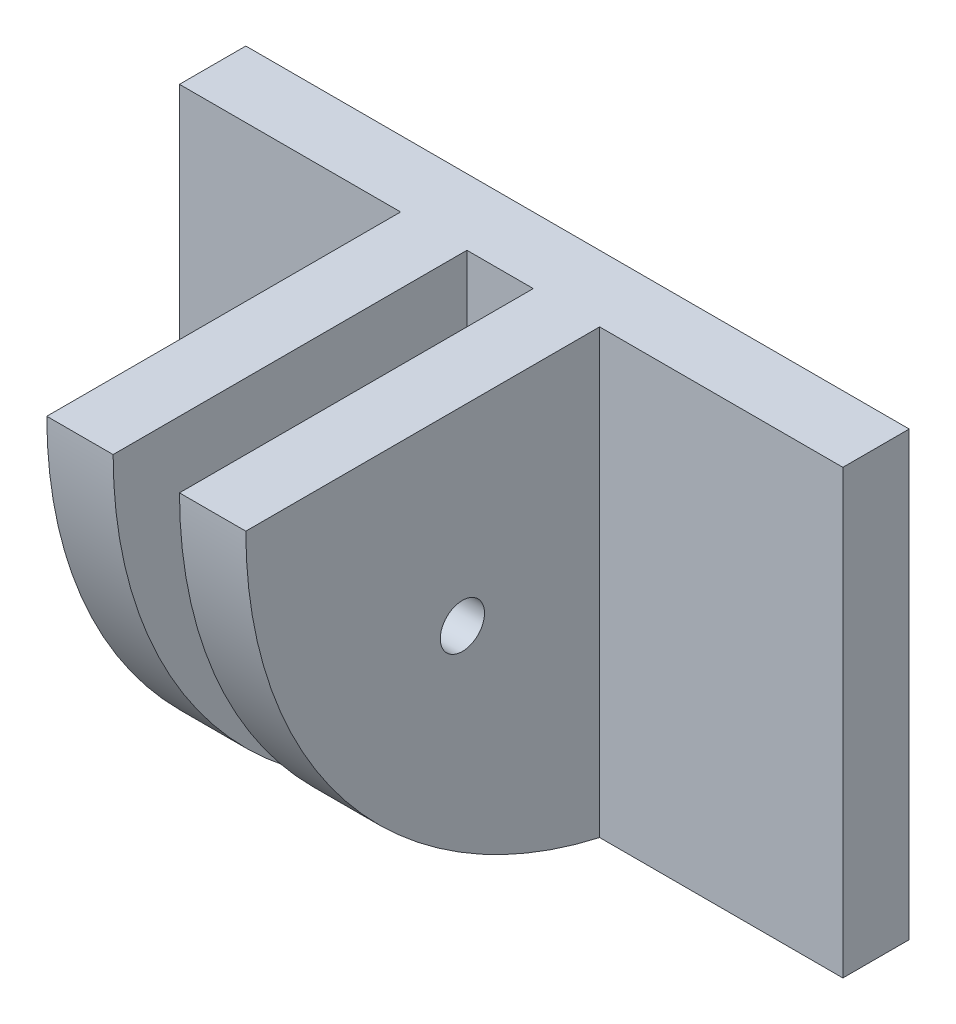
ISO-10303-21;
HEADER;
FILE_DESCRIPTION(('STEP AP214'),'2;1');
FILE_NAME('part.step','',(''),(''),'','','');
FILE_SCHEMA(('AUTOMOTIVE_DESIGN { 1 0 10303 214 1 1 1 1 }'));
ENDSEC;
DATA;
#1=APPLICATION_CONTEXT('core data for automotive mechanical design processes');
#2=APPLICATION_PROTOCOL_DEFINITION('international standard','automotive_design',2000,#1);
#3=PRODUCT_CONTEXT('',#1,'mechanical');
#4=PRODUCT('Part','Part','',(#3));
#5=PRODUCT_RELATED_PRODUCT_CATEGORY('part','',(#4));
#6=PRODUCT_DEFINITION_FORMATION('','',#4);
#7=PRODUCT_DEFINITION_CONTEXT('part definition',#1,'design');
#8=PRODUCT_DEFINITION('design','',#6,#7);
#9=PRODUCT_DEFINITION_SHAPE('','',#8);
#10=(LENGTH_UNIT() NAMED_UNIT(*) SI_UNIT(.MILLI.,.METRE.));
#11=(NAMED_UNIT(*) PLANE_ANGLE_UNIT() SI_UNIT($,.RADIAN.));
#12=(NAMED_UNIT(*) SI_UNIT($,.STERADIAN.) SOLID_ANGLE_UNIT());
#13=UNCERTAINTY_MEASURE_WITH_UNIT(LENGTH_MEASURE(1.E-05),#10,'distance_accuracy_value','');
#14=(GEOMETRIC_REPRESENTATION_CONTEXT(3) GLOBAL_UNCERTAINTY_ASSIGNED_CONTEXT((#13)) GLOBAL_UNIT_ASSIGNED_CONTEXT((#10,
#11,#12)) REPRESENTATION_CONTEXT('',''));
#15=CARTESIAN_POINT('',(0.,0.,0.));
#16=DIRECTION('',(0.,0.,1.));
#17=DIRECTION('',(1.,0.,0.));
#18=AXIS2_PLACEMENT_3D('',#15,#16,#17);
#19=CARTESIAN_POINT('',(0.,0.,3.));
#20=DIRECTION('',(0.,0.,-1.));
#21=DIRECTION('',(-1.,0.,0.));
#22=AXIS2_PLACEMENT_3D('',#19,#20,#21);
#23=PLANE('',#22);
#24=DIRECTION('',(0.,-1.,0.));
#25=VECTOR('',#24,1.);
#26=CARTESIAN_POINT('',(16.,0.,3.));
#27=LINE('',#26,#25);
#28=CARTESIAN_POINT('',(16.,20.,3.));
#29=VERTEX_POINT('',#28);
#30=CARTESIAN_POINT('',(16.,0.,3.));
#31=VERTEX_POINT('',#30);
#32=EDGE_CURVE('E70',#29,#31,#27,.T.);
#33=ORIENTED_EDGE('',*,*,#32,.F.);
#34=DIRECTION('',(-1.,0.,0.));
#35=VECTOR('',#34,1.);
#36=CARTESIAN_POINT('',(0.,20.,3.));
#37=LINE('',#36,#35);
#38=CARTESIAN_POINT('',(13.,20.,3.));
#39=VERTEX_POINT('',#38);
#40=EDGE_CURVE('E214',#29,#39,#37,.T.);
#41=ORIENTED_EDGE('',*,*,#40,.T.);
#42=DIRECTION('',(0.,-1.,0.));
#43=VECTOR('',#42,1.);
#44=CARTESIAN_POINT('',(13.,0.,3.));
#45=LINE('',#44,#43);
#46=CARTESIAN_POINT('',(13.,0.,3.));
#47=VERTEX_POINT('',#46);
#48=EDGE_CURVE('E174',#39,#47,#45,.T.);
#49=ORIENTED_EDGE('',*,*,#48,.T.);
#50=DIRECTION('',(1.,0.,0.));
#51=VECTOR('',#50,1.);
#52=CARTESIAN_POINT('',(0.,0.,3.));
#53=LINE('',#52,#51);
#54=EDGE_CURVE('E206',#47,#31,#53,.T.);
#55=ORIENTED_EDGE('',*,*,#54,.T.);
#56=EDGE_LOOP('',(#33,#41,#49,#55));
#57=FACE_BOUND('',#56,.T.);
#58=ADVANCED_FACE('F45',(#57),#23,.F.);
#59=DIRECTION('',(0.,-1.,0.));
#60=VECTOR('',#59,1.);
#61=CARTESIAN_POINT('',(10.,0.,3.));
#62=LINE('',#61,#60);
#63=CARTESIAN_POINT('',(10.,20.,3.));
#64=VERTEX_POINT('',#63);
#65=CARTESIAN_POINT('',(10.,0.,3.));
#66=VERTEX_POINT('',#65);
#67=EDGE_CURVE('E170',#64,#66,#62,.T.);
#68=ORIENTED_EDGE('',*,*,#67,.F.);
#69=CARTESIAN_POINT('',(0.,20.,3.));
#70=VERTEX_POINT('',#69);
#71=EDGE_CURVE('E209',#64,#70,#37,.T.);
#72=ORIENTED_EDGE('',*,*,#71,.T.);
#73=DIRECTION('',(0.,-1.,0.));
#74=VECTOR('',#73,1.);
#75=CARTESIAN_POINT('',(0.,0.,3.));
#76=LINE('',#75,#74);
#77=CARTESIAN_POINT('',(0.,0.,3.));
#78=VERTEX_POINT('',#77);
#79=EDGE_CURVE('E195',#70,#78,#76,.T.);
#80=ORIENTED_EDGE('',*,*,#79,.T.);
#81=EDGE_CURVE('E201',#78,#66,#53,.T.);
#82=ORIENTED_EDGE('',*,*,#81,.T.);
#83=EDGE_LOOP('',(#68,#72,#80,#82));
#84=FACE_BOUND('',#83,.T.);
#85=ADVANCED_FACE('F253',(#84),#23,.F.);
#86=CARTESIAN_POINT('',(0.,0.,3.));
#87=DIRECTION('',(1.,0.,0.));
#88=DIRECTION('',(0.,0.,-1.));
#89=AXIS2_PLACEMENT_3D('',#86,#87,#88);
#90=PLANE('',#89);
#91=DIRECTION('',(0.,-1.,0.));
#92=VECTOR('',#91,1.);
#93=CARTESIAN_POINT('',(0.,0.,0.));
#94=LINE('',#93,#92);
#95=CARTESIAN_POINT('',(0.,20.,0.));
#96=VERTEX_POINT('',#95);
#97=CARTESIAN_POINT('',(0.,0.,0.));
#98=VERTEX_POINT('',#97);
#99=EDGE_CURVE('E192',#96,#98,#94,.T.);
#100=ORIENTED_EDGE('',*,*,#99,.T.);
#101=DIRECTION('',(0.,0.,-1.));
#102=VECTOR('',#101,1.);
#103=CARTESIAN_POINT('',(0.,0.,3.));
#104=LINE('',#103,#102);
#105=EDGE_CURVE('E11',#78,#98,#104,.T.);
#106=ORIENTED_EDGE('',*,*,#105,.F.);
#107=ORIENTED_EDGE('',*,*,#79,.F.);
#108=DIRECTION('',(0.,0.,-1.));
#109=VECTOR('',#108,1.);
#110=CARTESIAN_POINT('',(0.,20.,3.));
#111=LINE('',#110,#109);
#112=EDGE_CURVE('E213',#70,#96,#111,.T.);
#113=ORIENTED_EDGE('',*,*,#112,.T.);
#114=EDGE_LOOP('',(#100,#106,#107,#113));
#115=FACE_BOUND('',#114,.T.);
#116=ADVANCED_FACE('F47',(#115),#90,.F.);
#117=CARTESIAN_POINT('',(0.,0.,3.));
#118=DIRECTION('',(0.,1.,0.));
#119=DIRECTION('',(0.,0.,1.));
#120=AXIS2_PLACEMENT_3D('',#117,#118,#119);
#121=PLANE('',#120);
#122=DIRECTION('',(1.,0.,0.));
#123=VECTOR('',#122,1.);
#124=CARTESIAN_POINT('',(0.,0.,0.));
#125=LINE('',#124,#123);
#126=CARTESIAN_POINT('',(30.,0.,0.));
#127=VERTEX_POINT('',#126);
#128=EDGE_CURVE('E218',#98,#127,#125,.T.);
#129=ORIENTED_EDGE('',*,*,#128,.T.);
#130=DIRECTION('',(0.,0.,-1.));
#131=VECTOR('',#130,1.);
#132=CARTESIAN_POINT('',(30.,0.,3.));
#133=LINE('',#132,#131);
#134=CARTESIAN_POINT('',(30.,0.,3.));
#135=VERTEX_POINT('',#134);
#136=EDGE_CURVE('E55',#135,#127,#133,.T.);
#137=ORIENTED_EDGE('',*,*,#136,.F.);
#138=CARTESIAN_POINT('',(19.,0.,3.));
#139=VERTEX_POINT('',#138);
#140=EDGE_CURVE('E199',#139,#135,#53,.T.);
#141=ORIENTED_EDGE('',*,*,#140,.F.);
#142=DIRECTION('',(-1.,0.,0.));
#143=VECTOR('',#142,1.);
#144=CARTESIAN_POINT('',(19.,0.,3.));
#145=LINE('',#144,#143);
#146=EDGE_CURVE('E136',#139,#31,#145,.T.);
#147=ORIENTED_EDGE('',*,*,#146,.T.);
#148=ORIENTED_EDGE('',*,*,#54,.F.);
#149=DIRECTION('',(-1.,0.,0.));
#150=VECTOR('',#149,1.);
#151=CARTESIAN_POINT('',(13.,0.,3.));
#152=LINE('',#151,#150);
#153=EDGE_CURVE('E188',#47,#66,#152,.T.);
#154=ORIENTED_EDGE('',*,*,#153,.T.);
#155=ORIENTED_EDGE('',*,*,#81,.F.);
#156=ORIENTED_EDGE('',*,*,#105,.T.);
#157=EDGE_LOOP('',(#129,#137,#141,#147,#148,#154,#155,#156));
#158=FACE_BOUND('',#157,.T.);
#159=ADVANCED_FACE('F265',(#158),#121,.F.);
#160=CARTESIAN_POINT('',(30.,0.,3.));
#161=DIRECTION('',(-1.,0.,0.));
#162=DIRECTION('',(0.,0.,1.));
#163=AXIS2_PLACEMENT_3D('',#160,#161,#162);
#164=PLANE('',#163);
#165=DIRECTION('',(0.,1.,0.));
#166=VECTOR('',#165,1.);
#167=CARTESIAN_POINT('',(30.,0.,0.));
#168=LINE('',#167,#166);
#169=CARTESIAN_POINT('',(30.,20.,0.));
#170=VERTEX_POINT('',#169);
#171=EDGE_CURVE('E221',#127,#170,#168,.T.);
#172=ORIENTED_EDGE('',*,*,#171,.T.);
#173=DIRECTION('',(0.,0.,-1.));
#174=VECTOR('',#173,1.);
#175=CARTESIAN_POINT('',(30.,20.,3.));
#176=LINE('',#175,#174);
#177=CARTESIAN_POINT('',(30.,20.,3.));
#178=VERTEX_POINT('',#177);
#179=EDGE_CURVE('E229',#178,#170,#176,.T.);
#180=ORIENTED_EDGE('',*,*,#179,.F.);
#181=DIRECTION('',(0.,1.,0.));
#182=VECTOR('',#181,1.);
#183=CARTESIAN_POINT('',(30.,0.,3.));
#184=LINE('',#183,#182);
#185=EDGE_CURVE('E205',#135,#178,#184,.T.);
#186=ORIENTED_EDGE('',*,*,#185,.F.);
#187=ORIENTED_EDGE('',*,*,#136,.T.);
#188=EDGE_LOOP('',(#172,#180,#186,#187));
#189=FACE_BOUND('',#188,.T.);
#190=ADVANCED_FACE('F239',(#189),#164,.F.);
#191=CARTESIAN_POINT('',(0.,20.,3.));
#192=DIRECTION('',(0.,-1.,0.));
#193=DIRECTION('',(0.,0.,-1.));
#194=AXIS2_PLACEMENT_3D('',#191,#192,#193);
#195=PLANE('',#194);
#196=DIRECTION('',(-1.,0.,0.));
#197=VECTOR('',#196,1.);
#198=CARTESIAN_POINT('',(0.,20.,0.));
#199=LINE('',#198,#197);
#200=EDGE_CURVE('E200',#170,#96,#199,.T.);
#201=ORIENTED_EDGE('',*,*,#200,.T.);
#202=ORIENTED_EDGE('',*,*,#112,.F.);
#203=ORIENTED_EDGE('',*,*,#71,.F.);
#204=DIRECTION('',(0.,0.,-1.));
#205=VECTOR('',#204,1.);
#206=CARTESIAN_POINT('',(10.,20.,3.));
#207=LINE('',#206,#205);
#208=CARTESIAN_POINT('',(10.,20.,19.));
#209=VERTEX_POINT('',#208);
#210=EDGE_CURVE('E182',#209,#64,#207,.T.);
#211=ORIENTED_EDGE('',*,*,#210,.F.);
#212=DIRECTION('',(-1.,0.,0.));
#213=VECTOR('',#212,1.);
#214=CARTESIAN_POINT('',(13.,20.,19.));
#215=LINE('',#214,#213);
#216=CARTESIAN_POINT('',(13.,20.,19.));
#217=VERTEX_POINT('',#216);
#218=EDGE_CURVE('E178',#217,#209,#215,.T.);
#219=ORIENTED_EDGE('',*,*,#218,.F.);
#220=DIRECTION('',(0.,0.,-1.));
#221=VECTOR('',#220,1.);
#222=CARTESIAN_POINT('',(13.,20.,3.));
#223=LINE('',#222,#221);
#224=EDGE_CURVE('E169',#217,#39,#223,.T.);
#225=ORIENTED_EDGE('',*,*,#224,.T.);
#226=ORIENTED_EDGE('',*,*,#40,.F.);
#227=DIRECTION('',(0.,0.,-1.));
#228=VECTOR('',#227,1.);
#229=CARTESIAN_POINT('',(16.,20.,3.));
#230=LINE('',#229,#228);
#231=CARTESIAN_POINT('',(16.,20.,19.));
#232=VERTEX_POINT('',#231);
#233=EDGE_CURVE('E130',#232,#29,#230,.T.);
#234=ORIENTED_EDGE('',*,*,#233,.F.);
#235=DIRECTION('',(-1.,0.,0.));
#236=VECTOR('',#235,1.);
#237=CARTESIAN_POINT('',(19.,20.,19.));
#238=LINE('',#237,#236);
#239=CARTESIAN_POINT('',(19.,20.,19.));
#240=VERTEX_POINT('',#239);
#241=EDGE_CURVE('E124',#240,#232,#238,.T.);
#242=ORIENTED_EDGE('',*,*,#241,.F.);
#243=DIRECTION('',(0.,0.,-1.));
#244=VECTOR('',#243,1.);
#245=CARTESIAN_POINT('',(19.,20.,3.));
#246=LINE('',#245,#244);
#247=CARTESIAN_POINT('',(19.,20.,3.));
#248=VERTEX_POINT('',#247);
#249=EDGE_CURVE('E128',#240,#248,#246,.T.);
#250=ORIENTED_EDGE('',*,*,#249,.T.);
#251=EDGE_CURVE('E210',#178,#248,#37,.T.);
#252=ORIENTED_EDGE('',*,*,#251,.F.);
#253=ORIENTED_EDGE('',*,*,#179,.T.);
#254=EDGE_LOOP('',(#201,#202,#203,#211,#219,#225,#226,#234,#242,#250,#252,#253));
#255=FACE_BOUND('',#254,.T.);
#256=ADVANCED_FACE('F126',(#255),#195,.F.);
#257=ORIENTED_EDGE('',*,*,#251,.T.);
#258=DIRECTION('',(0.,-1.,0.));
#259=VECTOR('',#258,1.);
#260=CARTESIAN_POINT('',(19.,0.,3.));
#261=LINE('',#260,#259);
#262=EDGE_CURVE('E62',#248,#139,#261,.T.);
#263=ORIENTED_EDGE('',*,*,#262,.T.);
#264=ORIENTED_EDGE('',*,*,#140,.T.);
#265=ORIENTED_EDGE('',*,*,#185,.T.);
#266=EDGE_LOOP('',(#257,#263,#264,#265));
#267=FACE_BOUND('',#266,.T.);
#268=ADVANCED_FACE('F268',(#267),#23,.F.);
#269=CARTESIAN_POINT('',(0.,0.,0.));
#270=DIRECTION('',(0.,0.,-1.));
#271=DIRECTION('',(-1.,0.,0.));
#272=AXIS2_PLACEMENT_3D('',#269,#270,#271);
#273=PLANE('',#272);
#274=ORIENTED_EDGE('',*,*,#99,.F.);
#275=ORIENTED_EDGE('',*,*,#200,.F.);
#276=ORIENTED_EDGE('',*,*,#171,.F.);
#277=ORIENTED_EDGE('',*,*,#128,.F.);
#278=EDGE_LOOP('',(#274,#275,#276,#277));
#279=FACE_BOUND('',#278,.T.);
#280=ADVANCED_FACE('F245',(#279),#273,.T.);
#281=CARTESIAN_POINT('',(13.,20.,-1.5));
#282=DIRECTION('',(-1.,0.,0.));
#283=DIRECTION('',(0.,0.,1.));
#284=AXIS2_PLACEMENT_3D('',#281,#282,#283);
#285=CYLINDRICAL_SURFACE('',#284,20.5);
#286=CARTESIAN_POINT('',(10.,20.,-1.5));
#287=DIRECTION('',(-1.,0.,0.));
#288=DIRECTION('',(0.,0.,-1.));
#289=AXIS2_PLACEMENT_3D('',#286,#287,#288);
#290=CIRCLE('',#289,20.5);
#291=EDGE_CURVE('E163',#66,#209,#290,.T.);
#292=ORIENTED_EDGE('',*,*,#291,.F.);
#293=ORIENTED_EDGE('',*,*,#153,.F.);
#294=CARTESIAN_POINT('',(13.,20.,-1.5));
#295=DIRECTION('',(-1.,0.,0.));
#296=DIRECTION('',(0.,0.,-1.));
#297=AXIS2_PLACEMENT_3D('',#294,#295,#296);
#298=CIRCLE('',#297,20.5);
#299=EDGE_CURVE('E165',#47,#217,#298,.T.);
#300=ORIENTED_EDGE('',*,*,#299,.T.);
#301=ORIENTED_EDGE('',*,*,#218,.T.);
#302=EDGE_LOOP('',(#292,#293,#300,#301));
#303=FACE_BOUND('',#302,.T.);
#304=ADVANCED_FACE('F264',(#303),#285,.T.);
#305=CARTESIAN_POINT('',(13.,20.,-1.5));
#306=DIRECTION('',(1.,0.,0.));
#307=DIRECTION('',(0.,0.,-1.));
#308=AXIS2_PLACEMENT_3D('',#305,#306,#307);
#309=PLANE('',#308);
#310=CARTESIAN_POINT('',(13.,11.392083612022,9.20552077437997));
#311=DIRECTION('',(1.,0.,0.));
#312=DIRECTION('',(0.,0.,-1.));
#313=AXIS2_PLACEMENT_3D('',#310,#311,#312);
#314=CIRCLE('',#313,1.);
#315=CARTESIAN_POINT('',(13.,11.392083612022,8.20552077437997));
#316=VERTEX_POINT('',#315);
#317=EDGE_CURVE('E152',#316,#316,#314,.T.);
#318=ORIENTED_EDGE('',*,*,#317,.F.);
#319=EDGE_LOOP('',(#318));
#320=FACE_BOUND('',#319,.T.);
#321=ORIENTED_EDGE('',*,*,#299,.F.);
#322=ORIENTED_EDGE('',*,*,#48,.F.);
#323=ORIENTED_EDGE('',*,*,#224,.F.);
#324=EDGE_LOOP('',(#321,#322,#323));
#325=FACE_BOUND('',#324,.T.);
#326=ADVANCED_FACE('F261',(#320,#325),#309,.T.);
#327=CARTESIAN_POINT('',(10.,20.,-1.5));
#328=DIRECTION('',(1.,0.,0.));
#329=DIRECTION('',(0.,0.,-1.));
#330=AXIS2_PLACEMENT_3D('',#327,#328,#329);
#331=PLANE('',#330);
#332=CARTESIAN_POINT('',(10.,11.392083612022,9.20552077437997));
#333=DIRECTION('',(-1.,0.,0.));
#334=DIRECTION('',(0.,0.,1.));
#335=AXIS2_PLACEMENT_3D('',#332,#333,#334);
#336=CIRCLE('',#335,1.);
#337=CARTESIAN_POINT('',(10.,11.392083612022,10.20552077438));
#338=VERTEX_POINT('',#337);
#339=EDGE_CURVE('E400',#338,#338,#336,.T.);
#340=ORIENTED_EDGE('',*,*,#339,.F.);
#341=EDGE_LOOP('',(#340));
#342=FACE_BOUND('',#341,.T.);
#343=ORIENTED_EDGE('',*,*,#291,.T.);
#344=ORIENTED_EDGE('',*,*,#210,.T.);
#345=ORIENTED_EDGE('',*,*,#67,.T.);
#346=EDGE_LOOP('',(#343,#344,#345));
#347=FACE_BOUND('',#346,.T.);
#348=ADVANCED_FACE('F334',(#342,#347),#331,.F.);
#349=CARTESIAN_POINT('',(19.,20.,-1.5));
#350=DIRECTION('',(-1.,0.,0.));
#351=DIRECTION('',(0.,0.,1.));
#352=AXIS2_PLACEMENT_3D('',#349,#350,#351);
#353=CYLINDRICAL_SURFACE('',#352,20.5);
#354=CARTESIAN_POINT('',(16.,20.,-1.5));
#355=DIRECTION('',(-1.,0.,0.));
#356=DIRECTION('',(0.,0.,-1.));
#357=AXIS2_PLACEMENT_3D('',#354,#355,#356);
#358=CIRCLE('',#357,20.5);
#359=EDGE_CURVE('E157',#31,#232,#358,.T.);
#360=ORIENTED_EDGE('',*,*,#359,.F.);
#361=ORIENTED_EDGE('',*,*,#146,.F.);
#362=CARTESIAN_POINT('',(19.,20.,-1.5));
#363=DIRECTION('',(-1.,0.,0.));
#364=DIRECTION('',(0.,0.,-1.));
#365=AXIS2_PLACEMENT_3D('',#362,#363,#364);
#366=CIRCLE('',#365,20.5);
#367=EDGE_CURVE('E141',#139,#240,#366,.T.);
#368=ORIENTED_EDGE('',*,*,#367,.T.);
#369=ORIENTED_EDGE('',*,*,#241,.T.);
#370=EDGE_LOOP('',(#360,#361,#368,#369));
#371=FACE_BOUND('',#370,.T.);
#372=ADVANCED_FACE('F145',(#371),#353,.T.);
#373=CARTESIAN_POINT('',(19.,20.,-1.5));
#374=DIRECTION('',(1.,0.,0.));
#375=DIRECTION('',(0.,0.,-1.));
#376=AXIS2_PLACEMENT_3D('',#373,#374,#375);
#377=PLANE('',#376);
#378=CARTESIAN_POINT('',(19.,11.392083612022,9.20552077437997));
#379=DIRECTION('',(1.,0.,0.));
#380=DIRECTION('',(0.,0.,-1.));
#381=AXIS2_PLACEMENT_3D('',#378,#379,#380);
#382=CIRCLE('',#381,1.);
#383=CARTESIAN_POINT('',(19.,11.392083612022,8.20552077437997));
#384=VERTEX_POINT('',#383);
#385=EDGE_CURVE('E405',#384,#384,#382,.T.);
#386=ORIENTED_EDGE('',*,*,#385,.F.);
#387=EDGE_LOOP('',(#386));
#388=FACE_BOUND('',#387,.T.);
#389=ORIENTED_EDGE('',*,*,#367,.F.);
#390=ORIENTED_EDGE('',*,*,#262,.F.);
#391=ORIENTED_EDGE('',*,*,#249,.F.);
#392=EDGE_LOOP('',(#389,#390,#391));
#393=FACE_BOUND('',#392,.T.);
#394=ADVANCED_FACE('F140',(#388,#393),#377,.T.);
#395=CARTESIAN_POINT('',(16.,20.,-1.5));
#396=DIRECTION('',(1.,0.,0.));
#397=DIRECTION('',(0.,0.,-1.));
#398=AXIS2_PLACEMENT_3D('',#395,#396,#397);
#399=PLANE('',#398);
#400=CARTESIAN_POINT('',(16.,11.392083612022,9.20552077437997));
#401=DIRECTION('',(1.,0.,0.));
#402=DIRECTION('',(0.,0.,-1.));
#403=AXIS2_PLACEMENT_3D('',#400,#401,#402);
#404=CIRCLE('',#403,1.);
#405=CARTESIAN_POINT('',(16.,11.392083612022,8.20552077437997));
#406=VERTEX_POINT('',#405);
#407=EDGE_CURVE('E49',#406,#406,#404,.T.);
#408=ORIENTED_EDGE('',*,*,#407,.T.);
#409=EDGE_LOOP('',(#408));
#410=FACE_BOUND('',#409,.T.);
#411=ORIENTED_EDGE('',*,*,#359,.T.);
#412=ORIENTED_EDGE('',*,*,#233,.T.);
#413=ORIENTED_EDGE('',*,*,#32,.T.);
#414=EDGE_LOOP('',(#411,#412,#413));
#415=FACE_BOUND('',#414,.T.);
#416=ADVANCED_FACE('F362',(#410,#415),#399,.F.);
#417=CARTESIAN_POINT('',(35.,11.392083612022,9.20552077437997));
#418=DIRECTION('',(-1.,0.,0.));
#419=DIRECTION('',(0.,0.,1.));
#420=AXIS2_PLACEMENT_3D('',#417,#418,#419);
#421=CYLINDRICAL_SURFACE('',#420,1.);
#422=ORIENTED_EDGE('',*,*,#385,.T.);
#423=EDGE_LOOP('',(#422));
#424=FACE_BOUND('',#423,.T.);
#425=ORIENTED_EDGE('',*,*,#407,.F.);
#426=EDGE_LOOP('',(#425));
#427=FACE_BOUND('',#426,.T.);
#428=ADVANCED_FACE('F371',(#424,#427),#421,.F.);
#429=ORIENTED_EDGE('',*,*,#317,.T.);
#430=EDGE_LOOP('',(#429));
#431=FACE_BOUND('',#430,.T.);
#432=ORIENTED_EDGE('',*,*,#339,.T.);
#433=EDGE_LOOP('',(#432));
#434=FACE_BOUND('',#433,.T.);
#435=ADVANCED_FACE('F380',(#431,#434),#421,.F.);
#436=CLOSED_SHELL('',(#58,#85,#116,#159,#190,#256,#268,#280,#304,#326,#348,#372,#394,#416,#428,#435));
#437=MANIFOLD_SOLID_BREP('B2',#436);
#438=ADVANCED_BREP_SHAPE_REPRESENTATION('',(#18,#437),#14);
#439=SHAPE_DEFINITION_REPRESENTATION(#9,#438);
ENDSEC;
END-ISO-10303-21;
